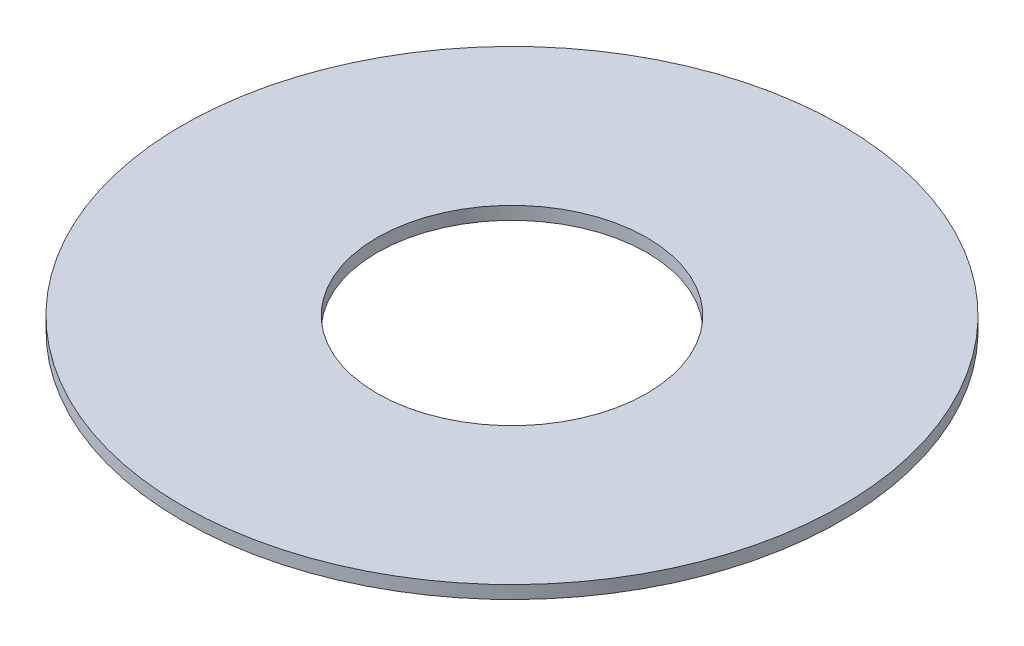
ISO-10303-21;
HEADER;
FILE_DESCRIPTION(('STEP AP214'),'2;1');
FILE_NAME('part.step','',(''),(''),'','','');
FILE_SCHEMA(('AUTOMOTIVE_DESIGN { 1 0 10303 214 1 1 1 1 }'));
ENDSEC;
DATA;
#1=APPLICATION_CONTEXT('core data for automotive mechanical design processes');
#2=APPLICATION_PROTOCOL_DEFINITION('international standard','automotive_design',2000,#1);
#3=PRODUCT_CONTEXT('',#1,'mechanical');
#4=PRODUCT('Part','Part','',(#3));
#5=PRODUCT_RELATED_PRODUCT_CATEGORY('part','',(#4));
#6=PRODUCT_DEFINITION_FORMATION('','',#4);
#7=PRODUCT_DEFINITION_CONTEXT('part definition',#1,'design');
#8=PRODUCT_DEFINITION('design','',#6,#7);
#9=PRODUCT_DEFINITION_SHAPE('','',#8);
#10=(LENGTH_UNIT() NAMED_UNIT(*) SI_UNIT(.MILLI.,.METRE.));
#11=(NAMED_UNIT(*) PLANE_ANGLE_UNIT() SI_UNIT($,.RADIAN.));
#12=(NAMED_UNIT(*) SI_UNIT($,.STERADIAN.) SOLID_ANGLE_UNIT());
#13=UNCERTAINTY_MEASURE_WITH_UNIT(LENGTH_MEASURE(1.E-05),#10,'distance_accuracy_value','');
#14=(GEOMETRIC_REPRESENTATION_CONTEXT(3) GLOBAL_UNCERTAINTY_ASSIGNED_CONTEXT((#13)) GLOBAL_UNIT_ASSIGNED_CONTEXT((#10,
#11,#12)) REPRESENTATION_CONTEXT('',''));
#15=CARTESIAN_POINT('',(0.,0.,0.));
#16=DIRECTION('',(0.,0.,1.));
#17=DIRECTION('',(1.,0.,0.));
#18=AXIS2_PLACEMENT_3D('',#15,#16,#17);
#19=CARTESIAN_POINT('',(0.,0.5,0.));
#20=DIRECTION('',(0.,1.,0.));
#21=DIRECTION('',(0.,0.,1.));
#22=AXIS2_PLACEMENT_3D('',#19,#20,#21);
#23=PLANE('',#22);
#24=CARTESIAN_POINT('',(0.,0.5,0.));
#25=DIRECTION('',(0.,1.,0.));
#26=DIRECTION('',(0.,0.,1.));
#27=AXIS2_PLACEMENT_3D('',#24,#25,#26);
#28=CIRCLE('',#27,12.7);
#29=CARTESIAN_POINT('',(0.,0.5,12.7));
#30=VERTEX_POINT('',#29);
#31=EDGE_CURVE('E10',#30,#30,#28,.T.);
#32=ORIENTED_EDGE('',*,*,#31,.T.);
#33=EDGE_LOOP('',(#32));
#34=FACE_BOUND('',#33,.T.);
#35=CARTESIAN_POINT('',(0.,0.5,0.));
#36=DIRECTION('',(0.,1.,0.));
#37=DIRECTION('',(0.,0.,1.));
#38=AXIS2_PLACEMENT_3D('',#35,#36,#37);
#39=CIRCLE('',#38,5.2);
#40=CARTESIAN_POINT('',(0.,0.5,5.2));
#41=VERTEX_POINT('',#40);
#42=EDGE_CURVE('E40',#41,#41,#39,.T.);
#43=ORIENTED_EDGE('',*,*,#42,.F.);
#44=EDGE_LOOP('',(#43));
#45=FACE_BOUND('',#44,.T.);
#46=ADVANCED_FACE('F29',(#34,#45),#23,.T.);
#47=CARTESIAN_POINT('',(0.,0.,0.));
#48=DIRECTION('',(0.,1.,0.));
#49=DIRECTION('',(0.,0.,1.));
#50=AXIS2_PLACEMENT_3D('',#47,#48,#49);
#51=PLANE('',#50);
#52=CARTESIAN_POINT('',(0.,0.,0.));
#53=DIRECTION('',(0.,1.,0.));
#54=DIRECTION('',(0.,0.,1.));
#55=AXIS2_PLACEMENT_3D('',#52,#53,#54);
#56=CIRCLE('',#55,12.7);
#57=CARTESIAN_POINT('',(0.,0.,12.7));
#58=VERTEX_POINT('',#57);
#59=EDGE_CURVE('E33',#58,#58,#56,.T.);
#60=ORIENTED_EDGE('',*,*,#59,.F.);
#61=EDGE_LOOP('',(#60));
#62=FACE_BOUND('',#61,.T.);
#63=CARTESIAN_POINT('',(0.,0.,0.));
#64=DIRECTION('',(0.,1.,0.));
#65=DIRECTION('',(0.,0.,1.));
#66=AXIS2_PLACEMENT_3D('',#63,#64,#65);
#67=CIRCLE('',#66,5.2);
#68=CARTESIAN_POINT('',(0.,0.,5.2));
#69=VERTEX_POINT('',#68);
#70=EDGE_CURVE('E42',#69,#69,#67,.T.);
#71=ORIENTED_EDGE('',*,*,#70,.T.);
#72=EDGE_LOOP('',(#71));
#73=FACE_BOUND('',#72,.T.);
#74=ADVANCED_FACE('F52',(#62,#73),#51,.F.);
#75=CARTESIAN_POINT('',(0.,0.5,0.));
#76=DIRECTION('',(0.,-1.,0.));
#77=DIRECTION('',(0.,0.,-1.));
#78=AXIS2_PLACEMENT_3D('',#75,#76,#77);
#79=CYLINDRICAL_SURFACE('',#78,12.7);
#80=ORIENTED_EDGE('',*,*,#31,.F.);
#81=EDGE_LOOP('',(#80));
#82=FACE_BOUND('',#81,.T.);
#83=ORIENTED_EDGE('',*,*,#59,.T.);
#84=EDGE_LOOP('',(#83));
#85=FACE_BOUND('',#84,.T.);
#86=ADVANCED_FACE('F31',(#82,#85),#79,.T.);
#87=CARTESIAN_POINT('',(0.,0.5,0.));
#88=DIRECTION('',(0.,-1.,0.));
#89=DIRECTION('',(0.,0.,-1.));
#90=AXIS2_PLACEMENT_3D('',#87,#88,#89);
#91=CYLINDRICAL_SURFACE('',#90,5.2);
#92=ORIENTED_EDGE('',*,*,#42,.T.);
#93=EDGE_LOOP('',(#92));
#94=FACE_BOUND('',#93,.T.);
#95=ORIENTED_EDGE('',*,*,#70,.F.);
#96=EDGE_LOOP('',(#95));
#97=FACE_BOUND('',#96,.T.);
#98=ADVANCED_FACE('F48',(#94,#97),#91,.F.);
#99=CLOSED_SHELL('',(#46,#74,#86,#98));
#100=MANIFOLD_SOLID_BREP('B2',#99);
#101=ADVANCED_BREP_SHAPE_REPRESENTATION('',(#18,#100),#14);
#102=SHAPE_DEFINITION_REPRESENTATION(#9,#101);
ENDSEC;
END-ISO-10303-21;
